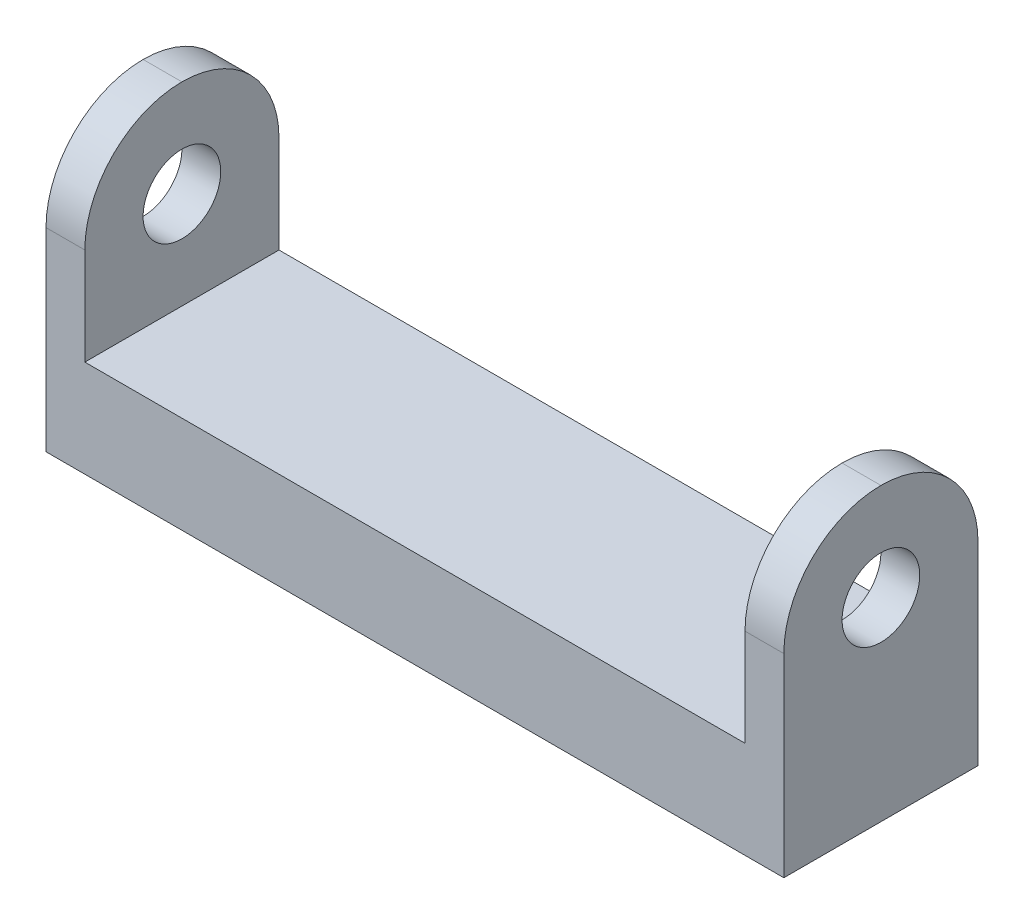
ISO-10303-21;
HEADER;
FILE_DESCRIPTION(('STEP AP214'),'2;1');
FILE_NAME('part.step','',(''),(''),'','','');
FILE_SCHEMA(('AUTOMOTIVE_DESIGN { 1 0 10303 214 1 1 1 1 }'));
ENDSEC;
DATA;
#1=APPLICATION_CONTEXT('core data for automotive mechanical design processes');
#2=APPLICATION_PROTOCOL_DEFINITION('international standard','automotive_design',2000,#1);
#3=PRODUCT_CONTEXT('',#1,'mechanical');
#4=PRODUCT('Part','Part','',(#3));
#5=PRODUCT_RELATED_PRODUCT_CATEGORY('part','',(#4));
#6=PRODUCT_DEFINITION_FORMATION('','',#4);
#7=PRODUCT_DEFINITION_CONTEXT('part definition',#1,'design');
#8=PRODUCT_DEFINITION('design','',#6,#7);
#9=PRODUCT_DEFINITION_SHAPE('','',#8);
#10=(LENGTH_UNIT() NAMED_UNIT(*) SI_UNIT(.MILLI.,.METRE.));
#11=(NAMED_UNIT(*) PLANE_ANGLE_UNIT() SI_UNIT($,.RADIAN.));
#12=(NAMED_UNIT(*) SI_UNIT($,.STERADIAN.) SOLID_ANGLE_UNIT());
#13=UNCERTAINTY_MEASURE_WITH_UNIT(LENGTH_MEASURE(1.E-05),#10,'distance_accuracy_value','');
#14=(GEOMETRIC_REPRESENTATION_CONTEXT(3) GLOBAL_UNCERTAINTY_ASSIGNED_CONTEXT((#13)) GLOBAL_UNIT_ASSIGNED_CONTEXT((#10,
#11,#12)) REPRESENTATION_CONTEXT('',''));
#15=CARTESIAN_POINT('',(0.,0.,0.));
#16=DIRECTION('',(0.,0.,1.));
#17=DIRECTION('',(1.,0.,0.));
#18=AXIS2_PLACEMENT_3D('',#15,#16,#17);
#19=CARTESIAN_POINT('',(380.,0.,100.));
#20=DIRECTION('',(0.,1.,0.));
#21=DIRECTION('',(-1.,0.,0.));
#22=AXIS2_PLACEMENT_3D('',#19,#20,#21);
#23=PLANE('',#22);
#24=DIRECTION('',(1.,0.,0.));
#25=VECTOR('',#24,1.);
#26=CARTESIAN_POINT('',(380.,0.,0.));
#27=LINE('',#26,#25);
#28=CARTESIAN_POINT('',(0.,0.,0.));
#29=VERTEX_POINT('',#28);
#30=CARTESIAN_POINT('',(380.,0.,0.));
#31=VERTEX_POINT('',#30);
#32=EDGE_CURVE('E143',#29,#31,#27,.T.);
#33=ORIENTED_EDGE('',*,*,#32,.T.);
#34=DIRECTION('',(0.,0.,-1.));
#35=VECTOR('',#34,1.);
#36=CARTESIAN_POINT('',(380.,0.,100.));
#37=LINE('',#36,#35);
#38=CARTESIAN_POINT('',(380.,0.,100.));
#39=VERTEX_POINT('',#38);
#40=EDGE_CURVE('E121',#39,#31,#37,.T.);
#41=ORIENTED_EDGE('',*,*,#40,.F.);
#42=DIRECTION('',(1.,0.,0.));
#43=VECTOR('',#42,1.);
#44=CARTESIAN_POINT('',(380.,0.,100.));
#45=LINE('',#44,#43);
#46=CARTESIAN_POINT('',(0.,0.,100.));
#47=VERTEX_POINT('',#46);
#48=EDGE_CURVE('E129',#47,#39,#45,.T.);
#49=ORIENTED_EDGE('',*,*,#48,.F.);
#50=DIRECTION('',(0.,0.,-1.));
#51=VECTOR('',#50,1.);
#52=CARTESIAN_POINT('',(0.,0.,100.));
#53=LINE('',#52,#51);
#54=EDGE_CURVE('E218',#47,#29,#53,.T.);
#55=ORIENTED_EDGE('',*,*,#54,.T.);
#56=EDGE_LOOP('',(#33,#41,#49,#55));
#57=FACE_BOUND('',#56,.T.);
#58=ADVANCED_FACE('F39',(#57),#23,.F.);
#59=CARTESIAN_POINT('',(380.,150.,100.));
#60=DIRECTION('',(-1.,0.,0.));
#61=DIRECTION('',(0.,0.,1.));
#62=AXIS2_PLACEMENT_3D('',#59,#60,#61);
#63=PLANE('',#62);
#64=CARTESIAN_POINT('',(380.,100.,50.));
#65=DIRECTION('',(1.,0.,0.));
#66=DIRECTION('',(0.,0.,-1.));
#67=AXIS2_PLACEMENT_3D('',#64,#65,#66);
#68=CIRCLE('',#67,20.);
#69=CARTESIAN_POINT('',(380.,100.,30.));
#70=VERTEX_POINT('',#69);
#71=EDGE_CURVE('E367',#70,#70,#68,.T.);
#72=ORIENTED_EDGE('',*,*,#71,.F.);
#73=EDGE_LOOP('',(#72));
#74=FACE_BOUND('',#73,.T.);
#75=CARTESIAN_POINT('',(380.,100.,50.));
#76=DIRECTION('',(-1.,0.,0.));
#77=DIRECTION('',(0.,0.,1.));
#78=AXIS2_PLACEMENT_3D('',#75,#76,#77);
#79=CIRCLE('',#78,50.);
#80=CARTESIAN_POINT('',(380.,100.,0.));
#81=VERTEX_POINT('',#80);
#82=CARTESIAN_POINT('',(380.,150.,50.));
#83=VERTEX_POINT('',#82);
#84=EDGE_CURVE('E49',#81,#83,#79,.F.);
#85=ORIENTED_EDGE('',*,*,#84,.T.);
#86=CARTESIAN_POINT('',(380.,100.,50.));
#87=DIRECTION('',(-1.,0.,0.));
#88=DIRECTION('',(0.,0.,1.));
#89=AXIS2_PLACEMENT_3D('',#86,#87,#88);
#90=CIRCLE('',#89,50.);
#91=CARTESIAN_POINT('',(380.,100.,100.));
#92=VERTEX_POINT('',#91);
#93=EDGE_CURVE('E11',#83,#92,#90,.F.);
#94=ORIENTED_EDGE('',*,*,#93,.T.);
#95=DIRECTION('',(0.,1.,0.));
#96=VECTOR('',#95,1.);
#97=CARTESIAN_POINT('',(380.,150.,100.));
#98=LINE('',#97,#96);
#99=EDGE_CURVE('E117',#39,#92,#98,.T.);
#100=ORIENTED_EDGE('',*,*,#99,.F.);
#101=ORIENTED_EDGE('',*,*,#40,.T.);
#102=DIRECTION('',(0.,1.,0.));
#103=VECTOR('',#102,1.);
#104=CARTESIAN_POINT('',(380.,150.,0.));
#105=LINE('',#104,#103);
#106=EDGE_CURVE('E192',#31,#81,#105,.T.);
#107=ORIENTED_EDGE('',*,*,#106,.T.);
#108=EDGE_LOOP('',(#85,#94,#100,#101,#107));
#109=FACE_BOUND('',#108,.T.);
#110=ADVANCED_FACE('F119',(#74,#109),#63,.F.);
#111=CARTESIAN_POINT('',(360.,49.9999999999999,100.));
#112=DIRECTION('',(1.,0.,0.));
#113=DIRECTION('',(0.,0.,-1.));
#114=AXIS2_PLACEMENT_3D('',#111,#112,#113);
#115=PLANE('',#114);
#116=CARTESIAN_POINT('',(360.,100.,50.));
#117=DIRECTION('',(1.,0.,0.));
#118=DIRECTION('',(0.,0.,-1.));
#119=AXIS2_PLACEMENT_3D('',#116,#117,#118);
#120=CIRCLE('',#119,20.);
#121=CARTESIAN_POINT('',(360.,100.,30.));
#122=VERTEX_POINT('',#121);
#123=EDGE_CURVE('E195',#122,#122,#120,.T.);
#124=ORIENTED_EDGE('',*,*,#123,.T.);
#125=EDGE_LOOP('',(#124));
#126=FACE_BOUND('',#125,.T.);
#127=DIRECTION('',(0.,-1.,0.));
#128=VECTOR('',#127,1.);
#129=CARTESIAN_POINT('',(360.,49.9999999999999,100.));
#130=LINE('',#129,#128);
#131=CARTESIAN_POINT('',(360.,99.9999999999999,100.));
#132=VERTEX_POINT('',#131);
#133=CARTESIAN_POINT('',(360.,49.9999999999999,100.));
#134=VERTEX_POINT('',#133);
#135=EDGE_CURVE('E128',#132,#134,#130,.T.);
#136=ORIENTED_EDGE('',*,*,#135,.F.);
#137=CARTESIAN_POINT('',(360.,99.9999999999999,50.));
#138=DIRECTION('',(1.,0.,0.));
#139=DIRECTION('',(0.,0.,-1.));
#140=AXIS2_PLACEMENT_3D('',#137,#138,#139);
#141=CIRCLE('',#140,50.);
#142=CARTESIAN_POINT('',(360.,150.,50.));
#143=VERTEX_POINT('',#142);
#144=EDGE_CURVE('E63',#132,#143,#141,.F.);
#145=ORIENTED_EDGE('',*,*,#144,.T.);
#146=CARTESIAN_POINT('',(360.,99.9999999999999,50.));
#147=DIRECTION('',(1.,0.,0.));
#148=DIRECTION('',(0.,0.,-1.));
#149=AXIS2_PLACEMENT_3D('',#146,#147,#148);
#150=CIRCLE('',#149,50.);
#151=CARTESIAN_POINT('',(360.,99.9999999999999,0.));
#152=VERTEX_POINT('',#151);
#153=EDGE_CURVE('E178',#143,#152,#150,.F.);
#154=ORIENTED_EDGE('',*,*,#153,.T.);
#155=DIRECTION('',(0.,-1.,0.));
#156=VECTOR('',#155,1.);
#157=CARTESIAN_POINT('',(360.,49.9999999999999,0.));
#158=LINE('',#157,#156);
#159=CARTESIAN_POINT('',(360.,49.9999999999999,0.));
#160=VERTEX_POINT('',#159);
#161=EDGE_CURVE('E222',#152,#160,#158,.T.);
#162=ORIENTED_EDGE('',*,*,#161,.T.);
#163=DIRECTION('',(0.,0.,-1.));
#164=VECTOR('',#163,1.);
#165=CARTESIAN_POINT('',(360.,49.9999999999999,100.));
#166=LINE('',#165,#164);
#167=EDGE_CURVE('E146',#134,#160,#166,.T.);
#168=ORIENTED_EDGE('',*,*,#167,.F.);
#169=EDGE_LOOP('',(#136,#145,#154,#162,#168));
#170=FACE_BOUND('',#169,.T.);
#171=ADVANCED_FACE('F262',(#126,#170),#115,.F.);
#172=CARTESIAN_POINT('',(20.,49.9999999999999,100.));
#173=DIRECTION('',(0.,-1.,0.));
#174=DIRECTION('',(0.,0.,-1.));
#175=AXIS2_PLACEMENT_3D('',#172,#173,#174);
#176=PLANE('',#175);
#177=DIRECTION('',(-1.,0.,0.));
#178=VECTOR('',#177,1.);
#179=CARTESIAN_POINT('',(20.,49.9999999999999,0.));
#180=LINE('',#179,#178);
#181=CARTESIAN_POINT('',(20.,49.9999999999999,0.));
#182=VERTEX_POINT('',#181);
#183=EDGE_CURVE('E225',#160,#182,#180,.T.);
#184=ORIENTED_EDGE('',*,*,#183,.T.);
#185=DIRECTION('',(0.,0.,-1.));
#186=VECTOR('',#185,1.);
#187=CARTESIAN_POINT('',(20.,49.9999999999999,100.));
#188=LINE('',#187,#186);
#189=CARTESIAN_POINT('',(20.,49.9999999999999,100.));
#190=VERTEX_POINT('',#189);
#191=EDGE_CURVE('E153',#190,#182,#188,.T.);
#192=ORIENTED_EDGE('',*,*,#191,.F.);
#193=DIRECTION('',(-1.,0.,0.));
#194=VECTOR('',#193,1.);
#195=CARTESIAN_POINT('',(20.,49.9999999999999,100.));
#196=LINE('',#195,#194);
#197=EDGE_CURVE('E211',#134,#190,#196,.T.);
#198=ORIENTED_EDGE('',*,*,#197,.F.);
#199=ORIENTED_EDGE('',*,*,#167,.T.);
#200=EDGE_LOOP('',(#184,#192,#198,#199));
#201=FACE_BOUND('',#200,.T.);
#202=ADVANCED_FACE('F263',(#201),#176,.F.);
#203=CARTESIAN_POINT('',(20.,150.,100.));
#204=DIRECTION('',(-1.,0.,0.));
#205=DIRECTION('',(0.,-1.,0.));
#206=AXIS2_PLACEMENT_3D('',#203,#204,#205);
#207=PLANE('',#206);
#208=CARTESIAN_POINT('',(20.,100.,50.));
#209=DIRECTION('',(-1.,0.,0.));
#210=DIRECTION('',(0.,-1.,0.));
#211=AXIS2_PLACEMENT_3D('',#208,#209,#210);
#212=CIRCLE('',#211,20.);
#213=CARTESIAN_POINT('',(20.,80.,50.));
#214=VERTEX_POINT('',#213);
#215=EDGE_CURVE('E199',#214,#214,#212,.T.);
#216=ORIENTED_EDGE('',*,*,#215,.T.);
#217=EDGE_LOOP('',(#216));
#218=FACE_BOUND('',#217,.T.);
#219=DIRECTION('',(0.,1.,0.));
#220=VECTOR('',#219,1.);
#221=CARTESIAN_POINT('',(20.,150.,0.));
#222=LINE('',#221,#220);
#223=CARTESIAN_POINT('',(20.,99.9999999999999,0.));
#224=VERTEX_POINT('',#223);
#225=EDGE_CURVE('E228',#182,#224,#222,.T.);
#226=ORIENTED_EDGE('',*,*,#225,.T.);
#227=CARTESIAN_POINT('',(20.,99.9999999999999,50.));
#228=DIRECTION('',(-1.,0.,0.));
#229=DIRECTION('',(0.,-1.,0.));
#230=AXIS2_PLACEMENT_3D('',#227,#228,#229);
#231=CIRCLE('',#230,50.);
#232=CARTESIAN_POINT('',(20.,150.,50.));
#233=VERTEX_POINT('',#232);
#234=EDGE_CURVE('E169',#224,#233,#231,.F.);
#235=ORIENTED_EDGE('',*,*,#234,.T.);
#236=CARTESIAN_POINT('',(20.,99.9999999999999,50.));
#237=DIRECTION('',(-1.,0.,0.));
#238=DIRECTION('',(0.,-1.,0.));
#239=AXIS2_PLACEMENT_3D('',#236,#237,#238);
#240=CIRCLE('',#239,50.);
#241=CARTESIAN_POINT('',(20.,99.9999999999999,100.));
#242=VERTEX_POINT('',#241);
#243=EDGE_CURVE('E166',#233,#242,#240,.F.);
#244=ORIENTED_EDGE('',*,*,#243,.T.);
#245=DIRECTION('',(0.,1.,0.));
#246=VECTOR('',#245,1.);
#247=CARTESIAN_POINT('',(20.,150.,100.));
#248=LINE('',#247,#246);
#249=EDGE_CURVE('E214',#190,#242,#248,.T.);
#250=ORIENTED_EDGE('',*,*,#249,.F.);
#251=ORIENTED_EDGE('',*,*,#191,.T.);
#252=EDGE_LOOP('',(#226,#235,#244,#250,#251));
#253=FACE_BOUND('',#252,.T.);
#254=ADVANCED_FACE('F241',(#218,#253),#207,.F.);
#255=CARTESIAN_POINT('',(0.,0.,100.));
#256=DIRECTION('',(1.,0.,0.));
#257=DIRECTION('',(0.,0.,-1.));
#258=AXIS2_PLACEMENT_3D('',#255,#256,#257);
#259=PLANE('',#258);
#260=CARTESIAN_POINT('',(0.,100.,50.));
#261=DIRECTION('',(1.,0.,0.));
#262=DIRECTION('',(0.,0.,-1.));
#263=AXIS2_PLACEMENT_3D('',#260,#261,#262);
#264=CIRCLE('',#263,20.);
#265=CARTESIAN_POINT('',(0.,100.,30.));
#266=VERTEX_POINT('',#265);
#267=EDGE_CURVE('E205',#266,#266,#264,.T.);
#268=ORIENTED_EDGE('',*,*,#267,.T.);
#269=EDGE_LOOP('',(#268));
#270=FACE_BOUND('',#269,.T.);
#271=CARTESIAN_POINT('',(0.,99.9999999999999,50.));
#272=DIRECTION('',(1.,0.,0.));
#273=DIRECTION('',(0.,0.,-1.));
#274=AXIS2_PLACEMENT_3D('',#271,#272,#273);
#275=CIRCLE('',#274,50.);
#276=CARTESIAN_POINT('',(0.,99.9999999999999,100.));
#277=VERTEX_POINT('',#276);
#278=CARTESIAN_POINT('',(0.,150.,50.));
#279=VERTEX_POINT('',#278);
#280=EDGE_CURVE('E145',#277,#279,#275,.F.);
#281=ORIENTED_EDGE('',*,*,#280,.T.);
#282=CARTESIAN_POINT('',(0.,99.9999999999999,50.));
#283=DIRECTION('',(1.,0.,0.));
#284=DIRECTION('',(0.,0.,-1.));
#285=AXIS2_PLACEMENT_3D('',#282,#283,#284);
#286=CIRCLE('',#285,50.);
#287=CARTESIAN_POINT('',(0.,99.9999999999999,0.));
#288=VERTEX_POINT('',#287);
#289=EDGE_CURVE('E150',#279,#288,#286,.F.);
#290=ORIENTED_EDGE('',*,*,#289,.T.);
#291=DIRECTION('',(0.,-1.,0.));
#292=VECTOR('',#291,1.);
#293=CARTESIAN_POINT('',(0.,0.,0.));
#294=LINE('',#293,#292);
#295=EDGE_CURVE('E140',#288,#29,#294,.T.);
#296=ORIENTED_EDGE('',*,*,#295,.T.);
#297=ORIENTED_EDGE('',*,*,#54,.F.);
#298=DIRECTION('',(0.,-1.,0.));
#299=VECTOR('',#298,1.);
#300=CARTESIAN_POINT('',(0.,0.,100.));
#301=LINE('',#300,#299);
#302=EDGE_CURVE('E135',#277,#47,#301,.T.);
#303=ORIENTED_EDGE('',*,*,#302,.F.);
#304=EDGE_LOOP('',(#281,#290,#296,#297,#303));
#305=FACE_BOUND('',#304,.T.);
#306=ADVANCED_FACE('F257',(#270,#305),#259,.F.);
#307=CARTESIAN_POINT('',(0.,0.,100.));
#308=DIRECTION('',(0.,0.,-1.));
#309=DIRECTION('',(-1.,0.,0.));
#310=AXIS2_PLACEMENT_3D('',#307,#308,#309);
#311=PLANE('',#310);
#312=ORIENTED_EDGE('',*,*,#249,.T.);
#313=DIRECTION('',(-1.,0.,0.));
#314=VECTOR('',#313,1.);
#315=CARTESIAN_POINT('',(0.,99.9999999999999,100.));
#316=LINE('',#315,#314);
#317=EDGE_CURVE('E175',#242,#277,#316,.T.);
#318=ORIENTED_EDGE('',*,*,#317,.T.);
#319=ORIENTED_EDGE('',*,*,#302,.T.);
#320=ORIENTED_EDGE('',*,*,#48,.T.);
#321=ORIENTED_EDGE('',*,*,#99,.T.);
#322=DIRECTION('',(-1.,0.,0.));
#323=VECTOR('',#322,1.);
#324=CARTESIAN_POINT('',(-1.38777878078144E-13,99.9999999999994,100.));
#325=LINE('',#324,#323);
#326=EDGE_CURVE('E172',#92,#132,#325,.T.);
#327=ORIENTED_EDGE('',*,*,#326,.T.);
#328=ORIENTED_EDGE('',*,*,#135,.T.);
#329=ORIENTED_EDGE('',*,*,#197,.T.);
#330=EDGE_LOOP('',(#312,#318,#319,#320,#321,#327,#328,#329));
#331=FACE_BOUND('',#330,.T.);
#332=ADVANCED_FACE('F133',(#331),#311,.F.);
#333=CARTESIAN_POINT('',(0.,0.,0.));
#334=DIRECTION('',(0.,0.,-1.));
#335=DIRECTION('',(-1.,0.,0.));
#336=AXIS2_PLACEMENT_3D('',#333,#334,#335);
#337=PLANE('',#336);
#338=ORIENTED_EDGE('',*,*,#295,.F.);
#339=DIRECTION('',(-1.,0.,0.));
#340=VECTOR('',#339,1.);
#341=CARTESIAN_POINT('',(20.,99.9999999999999,0.));
#342=LINE('',#341,#340);
#343=EDGE_CURVE('E162',#288,#224,#342,.F.);
#344=ORIENTED_EDGE('',*,*,#343,.T.);
#345=ORIENTED_EDGE('',*,*,#225,.F.);
#346=ORIENTED_EDGE('',*,*,#183,.F.);
#347=ORIENTED_EDGE('',*,*,#161,.F.);
#348=DIRECTION('',(-1.,0.,0.));
#349=VECTOR('',#348,1.);
#350=CARTESIAN_POINT('',(380.,100.,0.));
#351=LINE('',#350,#349);
#352=EDGE_CURVE('E159',#152,#81,#351,.F.);
#353=ORIENTED_EDGE('',*,*,#352,.T.);
#354=ORIENTED_EDGE('',*,*,#106,.F.);
#355=ORIENTED_EDGE('',*,*,#32,.F.);
#356=EDGE_LOOP('',(#338,#344,#345,#346,#347,#353,#354,#355));
#357=FACE_BOUND('',#356,.T.);
#358=ADVANCED_FACE('F247',(#357),#337,.T.);
#359=CARTESIAN_POINT('',(0.,99.9999999999999,50.));
#360=DIRECTION('',(-1.,0.,0.));
#361=DIRECTION('',(0.,0.,1.));
#362=AXIS2_PLACEMENT_3D('',#359,#360,#361);
#363=CYLINDRICAL_SURFACE('',#362,50.);
#364=ORIENTED_EDGE('',*,*,#317,.F.);
#365=ORIENTED_EDGE('',*,*,#243,.F.);
#366=DIRECTION('',(-1.,0.,0.));
#367=VECTOR('',#366,1.);
#368=CARTESIAN_POINT('',(0.,150.,50.));
#369=LINE('',#368,#367);
#370=EDGE_CURVE('E184',#279,#233,#369,.F.);
#371=ORIENTED_EDGE('',*,*,#370,.F.);
#372=ORIENTED_EDGE('',*,*,#280,.F.);
#373=EDGE_LOOP('',(#364,#365,#371,#372));
#374=FACE_BOUND('',#373,.T.);
#375=ADVANCED_FACE('F254',(#374),#363,.T.);
#376=CARTESIAN_POINT('',(0.,99.9999999999999,50.));
#377=DIRECTION('',(1.,0.,0.));
#378=DIRECTION('',(0.,0.,-1.));
#379=AXIS2_PLACEMENT_3D('',#376,#377,#378);
#380=CYLINDRICAL_SURFACE('',#379,50.);
#381=ORIENTED_EDGE('',*,*,#234,.F.);
#382=ORIENTED_EDGE('',*,*,#343,.F.);
#383=ORIENTED_EDGE('',*,*,#289,.F.);
#384=ORIENTED_EDGE('',*,*,#370,.T.);
#385=EDGE_LOOP('',(#381,#382,#383,#384));
#386=FACE_BOUND('',#385,.T.);
#387=ADVANCED_FACE('F250',(#386),#380,.T.);
#388=CARTESIAN_POINT('',(360.,99.9999999999999,50.));
#389=DIRECTION('',(1.,0.,0.));
#390=DIRECTION('',(0.,1.,0.));
#391=AXIS2_PLACEMENT_3D('',#388,#389,#390);
#392=CYLINDRICAL_SURFACE('',#391,50.);
#393=DIRECTION('',(-1.,0.,0.));
#394=VECTOR('',#393,1.);
#395=CARTESIAN_POINT('',(360.,150.,50.));
#396=LINE('',#395,#394);
#397=EDGE_CURVE('E43',#83,#143,#396,.T.);
#398=ORIENTED_EDGE('',*,*,#397,.F.);
#399=ORIENTED_EDGE('',*,*,#84,.F.);
#400=ORIENTED_EDGE('',*,*,#352,.F.);
#401=ORIENTED_EDGE('',*,*,#153,.F.);
#402=EDGE_LOOP('',(#398,#399,#400,#401));
#403=FACE_BOUND('',#402,.T.);
#404=ADVANCED_FACE('F41',(#403),#392,.T.);
#405=CARTESIAN_POINT('',(-1.38777878078144E-13,99.9999999999994,50.));
#406=DIRECTION('',(-1.,0.,0.));
#407=DIRECTION('',(0.,-1.,0.));
#408=AXIS2_PLACEMENT_3D('',#405,#406,#407);
#409=CYLINDRICAL_SURFACE('',#408,50.);
#410=ORIENTED_EDGE('',*,*,#93,.F.);
#411=ORIENTED_EDGE('',*,*,#397,.T.);
#412=ORIENTED_EDGE('',*,*,#144,.F.);
#413=ORIENTED_EDGE('',*,*,#326,.F.);
#414=EDGE_LOOP('',(#410,#411,#412,#413));
#415=FACE_BOUND('',#414,.T.);
#416=ADVANCED_FACE('F260',(#415),#409,.T.);
#417=CARTESIAN_POINT('',(0.,100.,50.));
#418=DIRECTION('',(1.,0.,0.));
#419=DIRECTION('',(0.,0.,-1.));
#420=AXIS2_PLACEMENT_3D('',#417,#418,#419);
#421=CYLINDRICAL_SURFACE('',#420,20.);
#422=ORIENTED_EDGE('',*,*,#267,.F.);
#423=EDGE_LOOP('',(#422));
#424=FACE_BOUND('',#423,.T.);
#425=ORIENTED_EDGE('',*,*,#215,.F.);
#426=EDGE_LOOP('',(#425));
#427=FACE_BOUND('',#426,.T.);
#428=ADVANCED_FACE('F285',(#424,#427),#421,.F.);
#429=ORIENTED_EDGE('',*,*,#71,.T.);
#430=EDGE_LOOP('',(#429));
#431=FACE_BOUND('',#430,.T.);
#432=ORIENTED_EDGE('',*,*,#123,.F.);
#433=EDGE_LOOP('',(#432));
#434=FACE_BOUND('',#433,.T.);
#435=ADVANCED_FACE('F290',(#431,#434),#421,.F.);
#436=CLOSED_SHELL('',(#58,#110,#171,#202,#254,#306,#332,#358,#375,#387,#404,#416,#428,#435));
#437=MANIFOLD_SOLID_BREP('B2',#436);
#438=ADVANCED_BREP_SHAPE_REPRESENTATION('',(#18,#437),#14);
#439=SHAPE_DEFINITION_REPRESENTATION(#9,#438);
ENDSEC;
END-ISO-10303-21;
